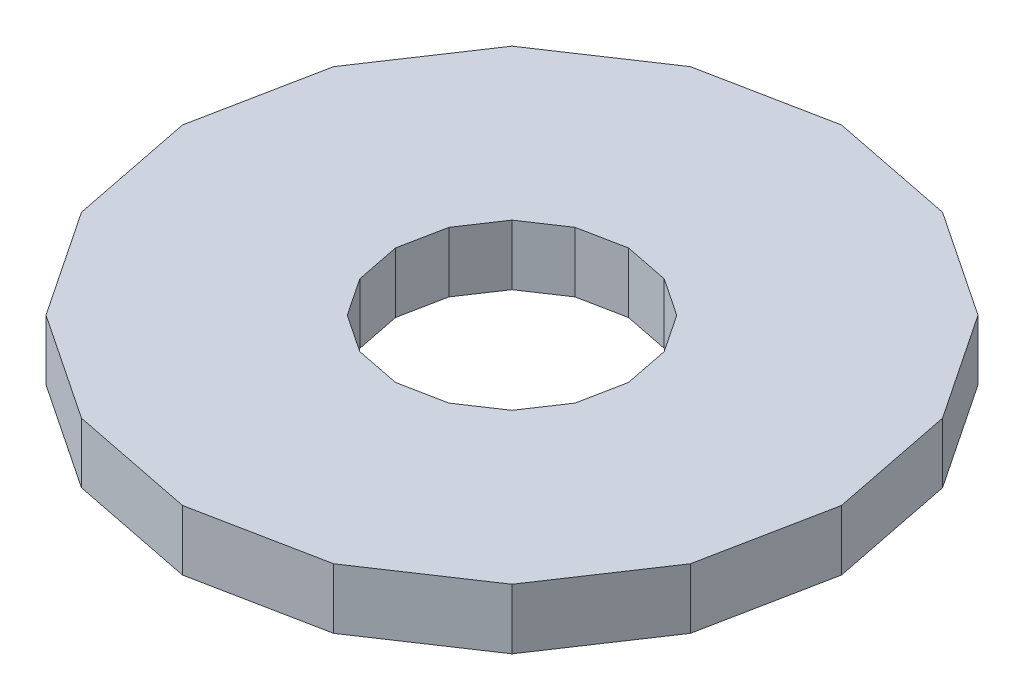
ISO-10303-21;
HEADER;
FILE_DESCRIPTION(('STEP AP214'),'2;1');
FILE_NAME('part.step','',(''),(''),'','','');
FILE_SCHEMA(('AUTOMOTIVE_DESIGN { 1 0 10303 214 1 1 1 1 }'));
ENDSEC;
DATA;
#1=APPLICATION_CONTEXT('core data for automotive mechanical design processes');
#2=APPLICATION_PROTOCOL_DEFINITION('international standard','automotive_design',2000,#1);
#3=PRODUCT_CONTEXT('',#1,'mechanical');
#4=PRODUCT('Part','Part','',(#3));
#5=PRODUCT_RELATED_PRODUCT_CATEGORY('part','',(#4));
#6=PRODUCT_DEFINITION_FORMATION('','',#4);
#7=PRODUCT_DEFINITION_CONTEXT('part definition',#1,'design');
#8=PRODUCT_DEFINITION('design','',#6,#7);
#9=PRODUCT_DEFINITION_SHAPE('','',#8);
#10=(LENGTH_UNIT() NAMED_UNIT(*) SI_UNIT(.MILLI.,.METRE.));
#11=(NAMED_UNIT(*) PLANE_ANGLE_UNIT() SI_UNIT($,.RADIAN.));
#12=(NAMED_UNIT(*) SI_UNIT($,.STERADIAN.) SOLID_ANGLE_UNIT());
#13=UNCERTAINTY_MEASURE_WITH_UNIT(LENGTH_MEASURE(1.E-05),#10,'distance_accuracy_value','');
#14=(GEOMETRIC_REPRESENTATION_CONTEXT(3) GLOBAL_UNCERTAINTY_ASSIGNED_CONTEXT((#13)) GLOBAL_UNIT_ASSIGNED_CONTEXT((#10,
#11,#12)) REPRESENTATION_CONTEXT('',''));
#15=CARTESIAN_POINT('',(0.,0.,0.));
#16=DIRECTION('',(0.,0.,1.));
#17=DIRECTION('',(1.,0.,0.));
#18=AXIS2_PLACEMENT_3D('',#15,#16,#17);
#19=CARTESIAN_POINT('',(0.,19.05,0.));
#20=DIRECTION('',(0.,1.,0.));
#21=DIRECTION('',(0.,0.,1.));
#22=AXIS2_PLACEMENT_3D('',#19,#20,#21);
#23=PLANE('',#22);
#24=DIRECTION('',(0.195090322016117,0.,-0.980785280403233));
#25=VECTOR('',#24,1.);
#26=CARTESIAN_POINT('',(96.2284131094797,19.05,39.8591137955861));
#27=LINE('',#26,#25);
#28=CARTESIAN_POINT('',(96.2284131094797,19.05,39.8591137955861));
#29=VERTEX_POINT('',#28);
#30=CARTESIAN_POINT('',(104.156883796215,19.05,-1.1518686280821E-12));
#31=VERTEX_POINT('',#30);
#32=EDGE_CURVE('E383',#29,#31,#27,.T.);
#33=ORIENTED_EDGE('',*,*,#32,.T.);
#34=DIRECTION('',(-0.19509032201614,0.,-0.980785280403228));
#35=VECTOR('',#34,1.);
#36=CARTESIAN_POINT('',(104.156883796215,19.05,-1.1518686280821E-12));
#37=LINE('',#36,#35);
#38=CARTESIAN_POINT('',(96.2284131094788,19.05,-39.8591137955883));
#39=VERTEX_POINT('',#38);
#40=EDGE_CURVE('E387',#31,#39,#37,.T.);
#41=ORIENTED_EDGE('',*,*,#40,.T.);
#42=DIRECTION('',(-0.555570233019612,0.,-0.831469612302539));
#43=VECTOR('',#42,1.);
#44=CARTESIAN_POINT('',(96.2284131094788,19.05,-39.8591137955883));
#45=LINE('',#44,#43);
#46=CARTESIAN_POINT('',(73.6500388395618,19.05,-73.6500388395635));
#47=VERTEX_POINT('',#46);
#48=EDGE_CURVE('E391',#39,#47,#45,.T.);
#49=ORIENTED_EDGE('',*,*,#48,.T.);
#50=DIRECTION('',(-0.831469612302552,0.,-0.555570233019593));
#51=VECTOR('',#50,1.);
#52=CARTESIAN_POINT('',(73.6500388395618,19.05,-73.6500388395635));
#53=LINE('',#52,#51);
#54=CARTESIAN_POINT('',(39.8591137955863,19.05,-96.2284131094796));
#55=VERTEX_POINT('',#54);
#56=EDGE_CURVE('E393',#47,#55,#53,.T.);
#57=ORIENTED_EDGE('',*,*,#56,.T.);
#58=DIRECTION('',(-0.980785280403233,0.,-0.195090322016117));
#59=VECTOR('',#58,1.);
#60=CARTESIAN_POINT('',(39.8591137955863,19.05,-96.2284131094796));
#61=LINE('',#60,#59);
#62=CARTESIAN_POINT('',(-1.20727870374467E-12,19.05,-104.156883796215));
#63=VERTEX_POINT('',#62);
#64=EDGE_CURVE('E395',#55,#63,#61,.T.);
#65=ORIENTED_EDGE('',*,*,#64,.T.);
#66=DIRECTION('',(-0.980785280403228,0.,0.19509032201614));
#67=VECTOR('',#66,1.);
#68=CARTESIAN_POINT('',(-1.20727870374467E-12,19.05,-104.156883796215));
#69=LINE('',#68,#67);
#70=CARTESIAN_POINT('',(-39.8591137955883,19.05,-96.2284131094787));
#71=VERTEX_POINT('',#70);
#72=EDGE_CURVE('E397',#63,#71,#69,.T.);
#73=ORIENTED_EDGE('',*,*,#72,.T.);
#74=DIRECTION('',(-0.831469612302539,0.,0.555570233019612));
#75=VECTOR('',#74,1.);
#76=CARTESIAN_POINT('',(-39.8591137955883,19.05,-96.2284131094787));
#77=LINE('',#76,#75);
#78=CARTESIAN_POINT('',(-73.6500388395635,19.05,-73.6500388395617));
#79=VERTEX_POINT('',#78);
#80=EDGE_CURVE('E399',#71,#79,#77,.T.);
#81=ORIENTED_EDGE('',*,*,#80,.T.);
#82=DIRECTION('',(-0.555570233019592,0.,0.831469612302552));
#83=VECTOR('',#82,1.);
#84=CARTESIAN_POINT('',(-73.6500388395635,19.05,-73.6500388395617));
#85=LINE('',#84,#83);
#86=CARTESIAN_POINT('',(-96.2284131094796,19.05,-39.8591137955861));
#87=VERTEX_POINT('',#86);
#88=EDGE_CURVE('E401',#79,#87,#85,.T.);
#89=ORIENTED_EDGE('',*,*,#88,.T.);
#90=DIRECTION('',(-0.195090322016117,0.,0.980785280403233));
#91=VECTOR('',#90,1.);
#92=CARTESIAN_POINT('',(-96.2284131094796,19.05,-39.8591137955861));
#93=LINE('',#92,#91);
#94=CARTESIAN_POINT('',(-104.156883796215,19.05,1.24884778880373E-12));
#95=VERTEX_POINT('',#94);
#96=EDGE_CURVE('E403',#87,#95,#93,.T.);
#97=ORIENTED_EDGE('',*,*,#96,.T.);
#98=DIRECTION('',(0.195090322016139,0.,0.980785280403228));
#99=VECTOR('',#98,1.);
#100=CARTESIAN_POINT('',(-104.156883796215,19.05,1.24884778880373E-12));
#101=LINE('',#100,#99);
#102=CARTESIAN_POINT('',(-96.2284131094788,19.05,39.8591137955883));
#103=VERTEX_POINT('',#102);
#104=EDGE_CURVE('E405',#95,#103,#101,.T.);
#105=ORIENTED_EDGE('',*,*,#104,.T.);
#106=DIRECTION('',(0.555570233019612,0.,0.831469612302539));
#107=VECTOR('',#106,1.);
#108=CARTESIAN_POINT('',(-96.2284131094788,19.05,39.8591137955883));
#109=LINE('',#108,#107);
#110=CARTESIAN_POINT('',(-73.6500388395618,19.05,73.6500388395634));
#111=VERTEX_POINT('',#110);
#112=EDGE_CURVE('E407',#103,#111,#109,.T.);
#113=ORIENTED_EDGE('',*,*,#112,.T.);
#114=DIRECTION('',(0.831469612302552,0.,0.555570233019593));
#115=VECTOR('',#114,1.);
#116=CARTESIAN_POINT('',(-73.6500388395618,19.05,73.6500388395634));
#117=LINE('',#116,#115);
#118=CARTESIAN_POINT('',(-39.8591137955861,19.05,96.2284131094797));
#119=VERTEX_POINT('',#118);
#120=EDGE_CURVE('E409',#111,#119,#117,.T.);
#121=ORIENTED_EDGE('',*,*,#120,.T.);
#122=DIRECTION('',(0.980785280403233,0.,0.195090322016117));
#123=VECTOR('',#122,1.);
#124=CARTESIAN_POINT('',(-39.8591137955861,19.05,96.2284131094797));
#125=LINE('',#124,#123);
#126=CARTESIAN_POINT('',(1.17272126011478E-12,19.05,104.156883796215));
#127=VERTEX_POINT('',#126);
#128=EDGE_CURVE('E411',#119,#127,#125,.T.);
#129=ORIENTED_EDGE('',*,*,#128,.T.);
#130=DIRECTION('',(0.980785280403228,0.,-0.195090322016139));
#131=VECTOR('',#130,1.);
#132=CARTESIAN_POINT('',(1.17272126011478E-12,19.05,104.156883796215));
#133=LINE('',#132,#131);
#134=CARTESIAN_POINT('',(39.8591137955883,19.05,96.2284131094788));
#135=VERTEX_POINT('',#134);
#136=EDGE_CURVE('E413',#127,#135,#133,.T.);
#137=ORIENTED_EDGE('',*,*,#136,.T.);
#138=DIRECTION('',(0.831469612302539,0.,-0.555570233019612));
#139=VECTOR('',#138,1.);
#140=CARTESIAN_POINT('',(39.8591137955883,19.05,96.2284131094788));
#141=LINE('',#140,#139);
#142=CARTESIAN_POINT('',(73.6500388395635,19.05,73.6500388395618));
#143=VERTEX_POINT('',#142);
#144=EDGE_CURVE('E416',#135,#143,#141,.T.);
#145=ORIENTED_EDGE('',*,*,#144,.T.);
#146=DIRECTION('',(0.555570233019593,0.,-0.831469612302552));
#147=VECTOR('',#146,1.);
#148=CARTESIAN_POINT('',(73.6500388395635,19.05,73.6500388395618));
#149=LINE('',#148,#147);
#150=EDGE_CURVE('E418',#143,#29,#149,.T.);
#151=ORIENTED_EDGE('',*,*,#150,.T.);
#152=EDGE_LOOP('',(#33,#41,#49,#57,#65,#73,#81,#89,#97,#105,#113,#121,#129,#137,#145,#151));
#153=FACE_BOUND('',#152,.T.);
#154=DIRECTION('',(-0.19509032201614,0.,-0.980785280403228));
#155=VECTOR('',#154,1.);
#156=CARTESIAN_POINT('',(36.8230837081373,19.05,-4.44162525323351E-13));
#157=LINE('',#156,#155);
#158=CARTESIAN_POINT('',(36.8230837081373,19.05,-4.44162525323351E-13));
#159=VERTEX_POINT('',#158);
#160=CARTESIAN_POINT('',(34.0200933618977,19.05,-14.0915840636974));
#161=VERTEX_POINT('',#160);
#162=EDGE_CURVE('E253',#159,#161,#157,.T.);
#163=ORIENTED_EDGE('',*,*,#162,.F.);
#164=DIRECTION('',(0.195090322016117,0.,-0.980785280403233));
#165=VECTOR('',#164,1.);
#166=CARTESIAN_POINT('',(34.020093361898,19.05,14.0915840636966));
#167=LINE('',#166,#165);
#168=CARTESIAN_POINT('',(34.020093361898,19.05,14.0915840636966));
#169=VERTEX_POINT('',#168);
#170=EDGE_CURVE('E244',#169,#159,#167,.T.);
#171=ORIENTED_EDGE('',*,*,#170,.F.);
#172=DIRECTION('',(0.555570233019592,0.,-0.831469612302552));
#173=VECTOR('',#172,1.);
#174=CARTESIAN_POINT('',(26.0378521942241,19.05,26.0378521942235));
#175=LINE('',#174,#173);
#176=CARTESIAN_POINT('',(26.0378521942241,19.05,26.0378521942235));
#177=VERTEX_POINT('',#176);
#178=EDGE_CURVE('E300',#177,#169,#175,.T.);
#179=ORIENTED_EDGE('',*,*,#178,.F.);
#180=DIRECTION('',(0.831469612302539,0.,-0.555570233019612));
#181=VECTOR('',#180,1.);
#182=CARTESIAN_POINT('',(14.0915840636974,19.05,34.0200933618977));
#183=LINE('',#182,#181);
#184=CARTESIAN_POINT('',(14.0915840636974,19.05,34.0200933618977));
#185=VERTEX_POINT('',#184);
#186=EDGE_CURVE('E297',#185,#177,#183,.T.);
#187=ORIENTED_EDGE('',*,*,#186,.F.);
#188=DIRECTION('',(0.980785280403228,0.,-0.19509032201614));
#189=VECTOR('',#188,1.);
#190=CARTESIAN_POINT('',(4.22818382873991E-13,19.05,36.8230837081373));
#191=LINE('',#190,#189);
#192=CARTESIAN_POINT('',(4.22818382873991E-13,19.05,36.8230837081373));
#193=VERTEX_POINT('',#192);
#194=EDGE_CURVE('E294',#193,#185,#191,.T.);
#195=ORIENTED_EDGE('',*,*,#194,.F.);
#196=DIRECTION('',(0.980785280403233,0.,0.195090322016118));
#197=VECTOR('',#196,1.);
#198=CARTESIAN_POINT('',(-14.0915840636966,19.05,34.020093361898));
#199=LINE('',#198,#197);
#200=CARTESIAN_POINT('',(-14.0915840636966,19.05,34.020093361898));
#201=VERTEX_POINT('',#200);
#202=EDGE_CURVE('E292',#201,#193,#199,.T.);
#203=ORIENTED_EDGE('',*,*,#202,.F.);
#204=DIRECTION('',(0.831469612302552,0.,0.555570233019592));
#205=VECTOR('',#204,1.);
#206=CARTESIAN_POINT('',(-26.0378521942235,19.05,26.0378521942241));
#207=LINE('',#206,#205);
#208=CARTESIAN_POINT('',(-26.0378521942235,19.05,26.0378521942241));
#209=VERTEX_POINT('',#208);
#210=EDGE_CURVE('E289',#209,#201,#207,.T.);
#211=ORIENTED_EDGE('',*,*,#210,.F.);
#212=DIRECTION('',(0.555570233019612,0.,0.831469612302539));
#213=VECTOR('',#212,1.);
#214=CARTESIAN_POINT('',(-34.0200933618977,19.05,14.0915840636974));
#215=LINE('',#214,#213);
#216=CARTESIAN_POINT('',(-34.0200933618977,19.05,14.0915840636974));
#217=VERTEX_POINT('',#216);
#218=EDGE_CURVE('E287',#217,#209,#215,.T.);
#219=ORIENTED_EDGE('',*,*,#218,.F.);
#220=DIRECTION('',(0.195090322016139,0.,0.980785280403228));
#221=VECTOR('',#220,1.);
#222=CARTESIAN_POINT('',(-36.8230837081373,19.05,4.47365423314822E-13));
#223=LINE('',#222,#221);
#224=CARTESIAN_POINT('',(-36.8230837081373,19.05,4.47365423314822E-13));
#225=VERTEX_POINT('',#224);
#226=EDGE_CURVE('E284',#225,#217,#223,.T.);
#227=ORIENTED_EDGE('',*,*,#226,.F.);
#228=DIRECTION('',(-0.195090322016117,0.,0.980785280403233));
#229=VECTOR('',#228,1.);
#230=CARTESIAN_POINT('',(-34.020093361898,19.05,-14.0915840636966));
#231=LINE('',#230,#229);
#232=CARTESIAN_POINT('',(-34.020093361898,19.05,-14.0915840636966));
#233=VERTEX_POINT('',#232);
#234=EDGE_CURVE('E281',#233,#225,#231,.T.);
#235=ORIENTED_EDGE('',*,*,#234,.F.);
#236=DIRECTION('',(-0.555570233019593,0.,0.831469612302552));
#237=VECTOR('',#236,1.);
#238=CARTESIAN_POINT('',(-26.0378521942241,19.05,-26.0378521942235));
#239=LINE('',#238,#237);
#240=CARTESIAN_POINT('',(-26.0378521942241,19.05,-26.0378521942235));
#241=VERTEX_POINT('',#240);
#242=EDGE_CURVE('E279',#241,#233,#239,.T.);
#243=ORIENTED_EDGE('',*,*,#242,.F.);
#244=DIRECTION('',(-0.831469612302539,0.,0.555570233019612));
#245=VECTOR('',#244,1.);
#246=CARTESIAN_POINT('',(-14.0915840636974,19.05,-34.0200933618977));
#247=LINE('',#246,#245);
#248=CARTESIAN_POINT('',(-14.0915840636974,19.05,-34.0200933618977));
#249=VERTEX_POINT('',#248);
#250=EDGE_CURVE('E277',#249,#241,#247,.T.);
#251=ORIENTED_EDGE('',*,*,#250,.F.);
#252=DIRECTION('',(-0.980785280403228,0.,0.195090322016139));
#253=VECTOR('',#252,1.);
#254=CARTESIAN_POINT('',(-4.47547971630323E-13,19.05,-36.8230837081373));
#255=LINE('',#254,#253);
#256=CARTESIAN_POINT('',(-4.47547971630323E-13,19.05,-36.8230837081373));
#257=VERTEX_POINT('',#256);
#258=EDGE_CURVE('E275',#257,#249,#255,.T.);
#259=ORIENTED_EDGE('',*,*,#258,.F.);
#260=DIRECTION('',(-0.980785280403233,0.,-0.195090322016117));
#261=VECTOR('',#260,1.);
#262=CARTESIAN_POINT('',(14.0915840636966,19.05,-34.020093361898));
#263=LINE('',#262,#261);
#264=CARTESIAN_POINT('',(14.0915840636966,19.05,-34.020093361898));
#265=VERTEX_POINT('',#264);
#266=EDGE_CURVE('E273',#265,#257,#263,.T.);
#267=ORIENTED_EDGE('',*,*,#266,.F.);
#268=DIRECTION('',(-0.831469612302552,0.,-0.555570233019592));
#269=VECTOR('',#268,1.);
#270=CARTESIAN_POINT('',(26.0378521942235,19.05,-26.0378521942241));
#271=LINE('',#270,#269);
#272=CARTESIAN_POINT('',(26.0378521942235,19.05,-26.0378521942241));
#273=VERTEX_POINT('',#272);
#274=EDGE_CURVE('E269',#273,#265,#271,.T.);
#275=ORIENTED_EDGE('',*,*,#274,.F.);
#276=DIRECTION('',(-0.555570233019612,0.,-0.831469612302539));
#277=VECTOR('',#276,1.);
#278=CARTESIAN_POINT('',(34.0200933618977,19.05,-14.0915840636974));
#279=LINE('',#278,#277);
#280=EDGE_CURVE('E267',#161,#273,#279,.T.);
#281=ORIENTED_EDGE('',*,*,#280,.F.);
#282=EDGE_LOOP('',(#163,#171,#179,#187,#195,#203,#211,#219,#227,#235,#243,#251,#259,#267,#275,#281));
#283=FACE_BOUND('',#282,.T.);
#284=ADVANCED_FACE('F35',(#153,#283),#23,.T.);
#285=CARTESIAN_POINT('',(0.,0.,0.));
#286=DIRECTION('',(0.,1.,0.));
#287=DIRECTION('',(0.,0.,1.));
#288=AXIS2_PLACEMENT_3D('',#285,#286,#287);
#289=PLANE('',#288);
#290=DIRECTION('',(0.195090322016117,0.,-0.980785280403233));
#291=VECTOR('',#290,1.);
#292=CARTESIAN_POINT('',(96.2284131094797,0.,39.8591137955861));
#293=LINE('',#292,#291);
#294=CARTESIAN_POINT('',(96.2284131094797,0.,39.8591137955861));
#295=VERTEX_POINT('',#294);
#296=CARTESIAN_POINT('',(104.156883796215,0.,-1.1518686280821E-12));
#297=VERTEX_POINT('',#296);
#298=EDGE_CURVE('E262',#295,#297,#293,.T.);
#299=ORIENTED_EDGE('',*,*,#298,.F.);
#300=DIRECTION('',(0.555570233019593,0.,-0.831469612302552));
#301=VECTOR('',#300,1.);
#302=CARTESIAN_POINT('',(73.6500388395635,0.,73.6500388395618));
#303=LINE('',#302,#301);
#304=CARTESIAN_POINT('',(73.6500388395635,0.,73.6500388395618));
#305=VERTEX_POINT('',#304);
#306=EDGE_CURVE('E388',#305,#295,#303,.T.);
#307=ORIENTED_EDGE('',*,*,#306,.F.);
#308=DIRECTION('',(0.831469612302539,0.,-0.555570233019612));
#309=VECTOR('',#308,1.);
#310=CARTESIAN_POINT('',(39.8591137955883,0.,96.2284131094788));
#311=LINE('',#310,#309);
#312=CARTESIAN_POINT('',(39.8591137955883,0.,96.2284131094788));
#313=VERTEX_POINT('',#312);
#314=EDGE_CURVE('E451',#313,#305,#311,.T.);
#315=ORIENTED_EDGE('',*,*,#314,.F.);
#316=DIRECTION('',(0.980785280403228,0.,-0.195090322016139));
#317=VECTOR('',#316,1.);
#318=CARTESIAN_POINT('',(1.17272126011478E-12,0.,104.156883796215));
#319=LINE('',#318,#317);
#320=CARTESIAN_POINT('',(1.17272126011478E-12,0.,104.156883796215));
#321=VERTEX_POINT('',#320);
#322=EDGE_CURVE('E449',#321,#313,#319,.T.);
#323=ORIENTED_EDGE('',*,*,#322,.F.);
#324=DIRECTION('',(0.980785280403233,0.,0.195090322016117));
#325=VECTOR('',#324,1.);
#326=CARTESIAN_POINT('',(-39.8591137955861,0.,96.2284131094797));
#327=LINE('',#326,#325);
#328=CARTESIAN_POINT('',(-39.8591137955861,0.,96.2284131094797));
#329=VERTEX_POINT('',#328);
#330=EDGE_CURVE('E447',#329,#321,#327,.T.);
#331=ORIENTED_EDGE('',*,*,#330,.F.);
#332=DIRECTION('',(0.831469612302552,0.,0.555570233019593));
#333=VECTOR('',#332,1.);
#334=CARTESIAN_POINT('',(-73.6500388395618,0.,73.6500388395634));
#335=LINE('',#334,#333);
#336=CARTESIAN_POINT('',(-73.6500388395618,0.,73.6500388395634));
#337=VERTEX_POINT('',#336);
#338=EDGE_CURVE('E445',#337,#329,#335,.T.);
#339=ORIENTED_EDGE('',*,*,#338,.F.);
#340=DIRECTION('',(0.555570233019612,0.,0.831469612302539));
#341=VECTOR('',#340,1.);
#342=CARTESIAN_POINT('',(-96.2284131094788,0.,39.8591137955883));
#343=LINE('',#342,#341);
#344=CARTESIAN_POINT('',(-96.2284131094788,0.,39.8591137955883));
#345=VERTEX_POINT('',#344);
#346=EDGE_CURVE('E443',#345,#337,#343,.T.);
#347=ORIENTED_EDGE('',*,*,#346,.F.);
#348=DIRECTION('',(0.195090322016139,0.,0.980785280403228));
#349=VECTOR('',#348,1.);
#350=CARTESIAN_POINT('',(-104.156883796215,0.,1.24884778880373E-12));
#351=LINE('',#350,#349);
#352=CARTESIAN_POINT('',(-104.156883796215,0.,1.24884778880373E-12));
#353=VERTEX_POINT('',#352);
#354=EDGE_CURVE('E441',#353,#345,#351,.T.);
#355=ORIENTED_EDGE('',*,*,#354,.F.);
#356=DIRECTION('',(-0.195090322016117,0.,0.980785280403233));
#357=VECTOR('',#356,1.);
#358=CARTESIAN_POINT('',(-96.2284131094796,0.,-39.8591137955861));
#359=LINE('',#358,#357);
#360=CARTESIAN_POINT('',(-96.2284131094796,0.,-39.8591137955861));
#361=VERTEX_POINT('',#360);
#362=EDGE_CURVE('E439',#361,#353,#359,.T.);
#363=ORIENTED_EDGE('',*,*,#362,.F.);
#364=DIRECTION('',(-0.555570233019592,0.,0.831469612302552));
#365=VECTOR('',#364,1.);
#366=CARTESIAN_POINT('',(-73.6500388395635,0.,-73.6500388395617));
#367=LINE('',#366,#365);
#368=CARTESIAN_POINT('',(-73.6500388395635,0.,-73.6500388395617));
#369=VERTEX_POINT('',#368);
#370=EDGE_CURVE('E437',#369,#361,#367,.T.);
#371=ORIENTED_EDGE('',*,*,#370,.F.);
#372=DIRECTION('',(-0.831469612302539,0.,0.555570233019612));
#373=VECTOR('',#372,1.);
#374=CARTESIAN_POINT('',(-39.8591137955883,0.,-96.2284131094787));
#375=LINE('',#374,#373);
#376=CARTESIAN_POINT('',(-39.8591137955883,0.,-96.2284131094787));
#377=VERTEX_POINT('',#376);
#378=EDGE_CURVE('E435',#377,#369,#375,.T.);
#379=ORIENTED_EDGE('',*,*,#378,.F.);
#380=DIRECTION('',(-0.980785280403228,0.,0.19509032201614));
#381=VECTOR('',#380,1.);
#382=CARTESIAN_POINT('',(-1.20727870374467E-12,0.,-104.156883796215));
#383=LINE('',#382,#381);
#384=CARTESIAN_POINT('',(-1.20727870374467E-12,0.,-104.156883796215));
#385=VERTEX_POINT('',#384);
#386=EDGE_CURVE('E433',#385,#377,#383,.T.);
#387=ORIENTED_EDGE('',*,*,#386,.F.);
#388=DIRECTION('',(-0.980785280403233,0.,-0.195090322016117));
#389=VECTOR('',#388,1.);
#390=CARTESIAN_POINT('',(39.8591137955863,0.,-96.2284131094796));
#391=LINE('',#390,#389);
#392=CARTESIAN_POINT('',(39.8591137955863,0.,-96.2284131094796));
#393=VERTEX_POINT('',#392);
#394=EDGE_CURVE('E431',#393,#385,#391,.T.);
#395=ORIENTED_EDGE('',*,*,#394,.F.);
#396=DIRECTION('',(-0.831469612302552,0.,-0.555570233019593));
#397=VECTOR('',#396,1.);
#398=CARTESIAN_POINT('',(73.6500388395618,0.,-73.6500388395635));
#399=LINE('',#398,#397);
#400=CARTESIAN_POINT('',(73.6500388395618,0.,-73.6500388395635));
#401=VERTEX_POINT('',#400);
#402=EDGE_CURVE('E428',#401,#393,#399,.T.);
#403=ORIENTED_EDGE('',*,*,#402,.F.);
#404=DIRECTION('',(-0.555570233019612,0.,-0.831469612302539));
#405=VECTOR('',#404,1.);
#406=CARTESIAN_POINT('',(96.2284131094788,0.,-39.8591137955883));
#407=LINE('',#406,#405);
#408=CARTESIAN_POINT('',(96.2284131094788,0.,-39.8591137955883));
#409=VERTEX_POINT('',#408);
#410=EDGE_CURVE('E426',#409,#401,#407,.T.);
#411=ORIENTED_EDGE('',*,*,#410,.F.);
#412=DIRECTION('',(-0.19509032201614,0.,-0.980785280403228));
#413=VECTOR('',#412,1.);
#414=CARTESIAN_POINT('',(104.156883796215,0.,-1.1518686280821E-12));
#415=LINE('',#414,#413);
#416=EDGE_CURVE('E423',#297,#409,#415,.T.);
#417=ORIENTED_EDGE('',*,*,#416,.F.);
#418=EDGE_LOOP('',(#299,#307,#315,#323,#331,#339,#347,#355,#363,#371,#379,#387,#395,#403,#411,#417));
#419=FACE_BOUND('',#418,.T.);
#420=DIRECTION('',(0.195090322016117,0.,-0.980785280403233));
#421=VECTOR('',#420,1.);
#422=CARTESIAN_POINT('',(34.020093361898,0.,14.0915840636966));
#423=LINE('',#422,#421);
#424=CARTESIAN_POINT('',(34.020093361898,0.,14.0915840636966));
#425=VERTEX_POINT('',#424);
#426=CARTESIAN_POINT('',(36.8230837081373,0.,-4.44162525323351E-13));
#427=VERTEX_POINT('',#426);
#428=EDGE_CURVE('E58',#425,#427,#423,.T.);
#429=ORIENTED_EDGE('',*,*,#428,.T.);
#430=DIRECTION('',(-0.19509032201614,0.,-0.980785280403228));
#431=VECTOR('',#430,1.);
#432=CARTESIAN_POINT('',(36.8230837081373,0.,-4.44162525323351E-13));
#433=LINE('',#432,#431);
#434=CARTESIAN_POINT('',(34.0200933618977,0.,-14.0915840636974));
#435=VERTEX_POINT('',#434);
#436=EDGE_CURVE('E260',#427,#435,#433,.T.);
#437=ORIENTED_EDGE('',*,*,#436,.T.);
#438=DIRECTION('',(-0.555570233019612,0.,-0.831469612302539));
#439=VECTOR('',#438,1.);
#440=CARTESIAN_POINT('',(34.0200933618977,0.,-14.0915840636974));
#441=LINE('',#440,#439);
#442=CARTESIAN_POINT('',(26.0378521942235,0.,-26.0378521942241));
#443=VERTEX_POINT('',#442);
#444=EDGE_CURVE('E305',#435,#443,#441,.T.);
#445=ORIENTED_EDGE('',*,*,#444,.T.);
#446=DIRECTION('',(-0.831469612302552,0.,-0.555570233019592));
#447=VECTOR('',#446,1.);
#448=CARTESIAN_POINT('',(26.0378521942235,0.,-26.0378521942241));
#449=LINE('',#448,#447);
#450=CARTESIAN_POINT('',(14.0915840636966,0.,-34.020093361898));
#451=VERTEX_POINT('',#450);
#452=EDGE_CURVE('E309',#443,#451,#449,.T.);
#453=ORIENTED_EDGE('',*,*,#452,.T.);
#454=DIRECTION('',(-0.980785280403233,0.,-0.195090322016117));
#455=VECTOR('',#454,1.);
#456=CARTESIAN_POINT('',(14.0915840636966,0.,-34.020093361898));
#457=LINE('',#456,#455);
#458=CARTESIAN_POINT('',(-4.47547971630323E-13,0.,-36.8230837081373));
#459=VERTEX_POINT('',#458);
#460=EDGE_CURVE('E312',#451,#459,#457,.T.);
#461=ORIENTED_EDGE('',*,*,#460,.T.);
#462=DIRECTION('',(-0.980785280403228,0.,0.195090322016139));
#463=VECTOR('',#462,1.);
#464=CARTESIAN_POINT('',(-4.47547971630323E-13,0.,-36.8230837081373));
#465=LINE('',#464,#463);
#466=CARTESIAN_POINT('',(-14.0915840636974,0.,-34.0200933618977));
#467=VERTEX_POINT('',#466);
#468=EDGE_CURVE('E315',#459,#467,#465,.T.);
#469=ORIENTED_EDGE('',*,*,#468,.T.);
#470=DIRECTION('',(-0.831469612302539,0.,0.555570233019612));
#471=VECTOR('',#470,1.);
#472=CARTESIAN_POINT('',(-14.0915840636974,0.,-34.0200933618977));
#473=LINE('',#472,#471);
#474=CARTESIAN_POINT('',(-26.0378521942241,0.,-26.0378521942235));
#475=VERTEX_POINT('',#474);
#476=EDGE_CURVE('E318',#467,#475,#473,.T.);
#477=ORIENTED_EDGE('',*,*,#476,.T.);
#478=DIRECTION('',(-0.555570233019593,0.,0.831469612302552));
#479=VECTOR('',#478,1.);
#480=CARTESIAN_POINT('',(-26.0378521942241,0.,-26.0378521942235));
#481=LINE('',#480,#479);
#482=CARTESIAN_POINT('',(-34.020093361898,0.,-14.0915840636966));
#483=VERTEX_POINT('',#482);
#484=EDGE_CURVE('E321',#475,#483,#481,.T.);
#485=ORIENTED_EDGE('',*,*,#484,.T.);
#486=DIRECTION('',(-0.195090322016117,0.,0.980785280403233));
#487=VECTOR('',#486,1.);
#488=CARTESIAN_POINT('',(-34.020093361898,0.,-14.0915840636966));
#489=LINE('',#488,#487);
#490=CARTESIAN_POINT('',(-36.8230837081373,0.,4.47365423314822E-13));
#491=VERTEX_POINT('',#490);
#492=EDGE_CURVE('E324',#483,#491,#489,.T.);
#493=ORIENTED_EDGE('',*,*,#492,.T.);
#494=DIRECTION('',(0.195090322016139,0.,0.980785280403228));
#495=VECTOR('',#494,1.);
#496=CARTESIAN_POINT('',(-36.8230837081373,0.,4.47365423314822E-13));
#497=LINE('',#496,#495);
#498=CARTESIAN_POINT('',(-34.0200933618977,0.,14.0915840636974));
#499=VERTEX_POINT('',#498);
#500=EDGE_CURVE('E328',#491,#499,#497,.T.);
#501=ORIENTED_EDGE('',*,*,#500,.T.);
#502=DIRECTION('',(0.555570233019612,0.,0.831469612302539));
#503=VECTOR('',#502,1.);
#504=CARTESIAN_POINT('',(-34.0200933618977,0.,14.0915840636974));
#505=LINE('',#504,#503);
#506=CARTESIAN_POINT('',(-26.0378521942235,0.,26.0378521942241));
#507=VERTEX_POINT('',#506);
#508=EDGE_CURVE('E331',#499,#507,#505,.T.);
#509=ORIENTED_EDGE('',*,*,#508,.T.);
#510=DIRECTION('',(0.831469612302552,0.,0.555570233019592));
#511=VECTOR('',#510,1.);
#512=CARTESIAN_POINT('',(-26.0378521942235,0.,26.0378521942241));
#513=LINE('',#512,#511);
#514=CARTESIAN_POINT('',(-14.0915840636966,0.,34.020093361898));
#515=VERTEX_POINT('',#514);
#516=EDGE_CURVE('E334',#507,#515,#513,.T.);
#517=ORIENTED_EDGE('',*,*,#516,.T.);
#518=DIRECTION('',(0.980785280403233,0.,0.195090322016118));
#519=VECTOR('',#518,1.);
#520=CARTESIAN_POINT('',(-14.0915840636966,0.,34.020093361898));
#521=LINE('',#520,#519);
#522=CARTESIAN_POINT('',(4.22818382873991E-13,0.,36.8230837081373));
#523=VERTEX_POINT('',#522);
#524=EDGE_CURVE('E337',#515,#523,#521,.T.);
#525=ORIENTED_EDGE('',*,*,#524,.T.);
#526=DIRECTION('',(0.980785280403228,0.,-0.19509032201614));
#527=VECTOR('',#526,1.);
#528=CARTESIAN_POINT('',(4.22818382873991E-13,0.,36.8230837081373));
#529=LINE('',#528,#527);
#530=CARTESIAN_POINT('',(14.0915840636974,0.,34.0200933618977));
#531=VERTEX_POINT('',#530);
#532=EDGE_CURVE('E340',#523,#531,#529,.T.);
#533=ORIENTED_EDGE('',*,*,#532,.T.);
#534=DIRECTION('',(0.831469612302539,0.,-0.555570233019612));
#535=VECTOR('',#534,1.);
#536=CARTESIAN_POINT('',(14.0915840636974,0.,34.0200933618977));
#537=LINE('',#536,#535);
#538=CARTESIAN_POINT('',(26.0378521942241,0.,26.0378521942235));
#539=VERTEX_POINT('',#538);
#540=EDGE_CURVE('E343',#531,#539,#537,.T.);
#541=ORIENTED_EDGE('',*,*,#540,.T.);
#542=DIRECTION('',(0.555570233019592,0.,-0.831469612302552));
#543=VECTOR('',#542,1.);
#544=CARTESIAN_POINT('',(26.0378521942241,0.,26.0378521942235));
#545=LINE('',#544,#543);
#546=EDGE_CURVE('E254',#539,#425,#545,.T.);
#547=ORIENTED_EDGE('',*,*,#546,.T.);
#548=EDGE_LOOP('',(#429,#437,#445,#453,#461,#469,#477,#485,#493,#501,#509,#517,#525,#533,#541,#547));
#549=FACE_BOUND('',#548,.T.);
#550=ADVANCED_FACE('F505',(#419,#549),#289,.F.);
#551=CARTESIAN_POINT('',(96.2284131094797,19.05,39.8591137955861));
#552=DIRECTION('',(-0.980785280403233,0.,-0.195090322016117));
#553=DIRECTION('',(-0.195090322016117,0.,0.980785280403233));
#554=AXIS2_PLACEMENT_3D('',#551,#552,#553);
#555=PLANE('',#554);
#556=ORIENTED_EDGE('',*,*,#298,.T.);
#557=DIRECTION('',(0.,-1.,0.));
#558=VECTOR('',#557,1.);
#559=CARTESIAN_POINT('',(104.156883796215,19.05,-1.1518686280821E-12));
#560=LINE('',#559,#558);
#561=EDGE_CURVE('E11',#31,#297,#560,.T.);
#562=ORIENTED_EDGE('',*,*,#561,.F.);
#563=ORIENTED_EDGE('',*,*,#32,.F.);
#564=DIRECTION('',(0.,-1.,0.));
#565=VECTOR('',#564,1.);
#566=CARTESIAN_POINT('',(96.2284131094797,19.05,39.8591137955861));
#567=LINE('',#566,#565);
#568=EDGE_CURVE('E420',#29,#295,#567,.T.);
#569=ORIENTED_EDGE('',*,*,#568,.T.);
#570=EDGE_LOOP('',(#556,#562,#563,#569));
#571=FACE_BOUND('',#570,.T.);
#572=ADVANCED_FACE('F37',(#571),#555,.F.);
#573=CARTESIAN_POINT('',(104.156883796215,19.05,-1.1518686280821E-12));
#574=DIRECTION('',(-0.980785280403228,0.,0.19509032201614));
#575=DIRECTION('',(0.19509032201614,0.,0.980785280403228));
#576=AXIS2_PLACEMENT_3D('',#573,#574,#575);
#577=PLANE('',#576);
#578=ORIENTED_EDGE('',*,*,#416,.T.);
#579=DIRECTION('',(0.,-1.,0.));
#580=VECTOR('',#579,1.);
#581=CARTESIAN_POINT('',(96.2284131094788,19.05,-39.8591137955883));
#582=LINE('',#581,#580);
#583=EDGE_CURVE('E43',#39,#409,#582,.T.);
#584=ORIENTED_EDGE('',*,*,#583,.F.);
#585=ORIENTED_EDGE('',*,*,#40,.F.);
#586=ORIENTED_EDGE('',*,*,#561,.T.);
#587=EDGE_LOOP('',(#578,#584,#585,#586));
#588=FACE_BOUND('',#587,.T.);
#589=ADVANCED_FACE('F522',(#588),#577,.F.);
#590=CARTESIAN_POINT('',(96.2284131094788,19.05,-39.8591137955883));
#591=DIRECTION('',(-0.831469612302539,0.,0.555570233019612));
#592=DIRECTION('',(0.555570233019612,0.,0.831469612302539));
#593=AXIS2_PLACEMENT_3D('',#590,#591,#592);
#594=PLANE('',#593);
#595=ORIENTED_EDGE('',*,*,#410,.T.);
#596=DIRECTION('',(0.,-1.,0.));
#597=VECTOR('',#596,1.);
#598=CARTESIAN_POINT('',(73.6500388395618,19.05,-73.6500388395635));
#599=LINE('',#598,#597);
#600=EDGE_CURVE('E492',#47,#401,#599,.T.);
#601=ORIENTED_EDGE('',*,*,#600,.F.);
#602=ORIENTED_EDGE('',*,*,#48,.F.);
#603=ORIENTED_EDGE('',*,*,#583,.T.);
#604=EDGE_LOOP('',(#595,#601,#602,#603));
#605=FACE_BOUND('',#604,.T.);
#606=ADVANCED_FACE('F499',(#605),#594,.F.);
#607=CARTESIAN_POINT('',(73.6500388395618,19.05,-73.6500388395635));
#608=DIRECTION('',(-0.555570233019593,0.,0.831469612302552));
#609=DIRECTION('',(0.831469612302552,0.,0.555570233019593));
#610=AXIS2_PLACEMENT_3D('',#607,#608,#609);
#611=PLANE('',#610);
#612=ORIENTED_EDGE('',*,*,#402,.T.);
#613=DIRECTION('',(0.,-1.,0.));
#614=VECTOR('',#613,1.);
#615=CARTESIAN_POINT('',(39.8591137955863,19.05,-96.2284131094796));
#616=LINE('',#615,#614);
#617=EDGE_CURVE('E489',#55,#393,#616,.T.);
#618=ORIENTED_EDGE('',*,*,#617,.F.);
#619=ORIENTED_EDGE('',*,*,#56,.F.);
#620=ORIENTED_EDGE('',*,*,#600,.T.);
#621=EDGE_LOOP('',(#612,#618,#619,#620));
#622=FACE_BOUND('',#621,.T.);
#623=ADVANCED_FACE('F511',(#622),#611,.F.);
#624=CARTESIAN_POINT('',(39.8591137955863,19.05,-96.2284131094796));
#625=DIRECTION('',(-0.195090322016117,0.,0.980785280403233));
#626=DIRECTION('',(0.980785280403233,0.,0.195090322016117));
#627=AXIS2_PLACEMENT_3D('',#624,#625,#626);
#628=PLANE('',#627);
#629=ORIENTED_EDGE('',*,*,#394,.T.);
#630=DIRECTION('',(0.,-1.,0.));
#631=VECTOR('',#630,1.);
#632=CARTESIAN_POINT('',(-1.20727870374467E-12,19.05,-104.156883796215));
#633=LINE('',#632,#631);
#634=EDGE_CURVE('E486',#63,#385,#633,.T.);
#635=ORIENTED_EDGE('',*,*,#634,.F.);
#636=ORIENTED_EDGE('',*,*,#64,.F.);
#637=ORIENTED_EDGE('',*,*,#617,.T.);
#638=EDGE_LOOP('',(#629,#635,#636,#637));
#639=FACE_BOUND('',#638,.T.);
#640=ADVANCED_FACE('F515',(#639),#628,.F.);
#641=CARTESIAN_POINT('',(-1.20727870374467E-12,19.05,-104.156883796215));
#642=DIRECTION('',(0.19509032201614,0.,0.980785280403228));
#643=DIRECTION('',(0.980785280403228,0.,-0.19509032201614));
#644=AXIS2_PLACEMENT_3D('',#641,#642,#643);
#645=PLANE('',#644);
#646=ORIENTED_EDGE('',*,*,#386,.T.);
#647=DIRECTION('',(0.,-1.,0.));
#648=VECTOR('',#647,1.);
#649=CARTESIAN_POINT('',(-39.8591137955883,19.05,-96.2284131094787));
#650=LINE('',#649,#648);
#651=EDGE_CURVE('E483',#71,#377,#650,.T.);
#652=ORIENTED_EDGE('',*,*,#651,.F.);
#653=ORIENTED_EDGE('',*,*,#72,.F.);
#654=ORIENTED_EDGE('',*,*,#634,.T.);
#655=EDGE_LOOP('',(#646,#652,#653,#654));
#656=FACE_BOUND('',#655,.T.);
#657=ADVANCED_FACE('F575',(#656),#645,.F.);
#658=CARTESIAN_POINT('',(-39.8591137955883,19.05,-96.2284131094787));
#659=DIRECTION('',(0.555570233019612,0.,0.831469612302539));
#660=DIRECTION('',(0.831469612302539,0.,-0.555570233019612));
#661=AXIS2_PLACEMENT_3D('',#658,#659,#660);
#662=PLANE('',#661);
#663=ORIENTED_EDGE('',*,*,#378,.T.);
#664=DIRECTION('',(0.,-1.,0.));
#665=VECTOR('',#664,1.);
#666=CARTESIAN_POINT('',(-73.6500388395635,19.05,-73.6500388395617));
#667=LINE('',#666,#665);
#668=EDGE_CURVE('E480',#79,#369,#667,.T.);
#669=ORIENTED_EDGE('',*,*,#668,.F.);
#670=ORIENTED_EDGE('',*,*,#80,.F.);
#671=ORIENTED_EDGE('',*,*,#651,.T.);
#672=EDGE_LOOP('',(#663,#669,#670,#671));
#673=FACE_BOUND('',#672,.T.);
#674=ADVANCED_FACE('F572',(#673),#662,.F.);
#675=CARTESIAN_POINT('',(-73.6500388395635,19.05,-73.6500388395617));
#676=DIRECTION('',(0.831469612302552,0.,0.555570233019593));
#677=DIRECTION('',(0.555570233019593,0.,-0.831469612302552));
#678=AXIS2_PLACEMENT_3D('',#675,#676,#677);
#679=PLANE('',#678);
#680=ORIENTED_EDGE('',*,*,#370,.T.);
#681=DIRECTION('',(0.,-1.,0.));
#682=VECTOR('',#681,1.);
#683=CARTESIAN_POINT('',(-96.2284131094796,19.05,-39.8591137955861));
#684=LINE('',#683,#682);
#685=EDGE_CURVE('E477',#87,#361,#684,.T.);
#686=ORIENTED_EDGE('',*,*,#685,.F.);
#687=ORIENTED_EDGE('',*,*,#88,.F.);
#688=ORIENTED_EDGE('',*,*,#668,.T.);
#689=EDGE_LOOP('',(#680,#686,#687,#688));
#690=FACE_BOUND('',#689,.T.);
#691=ADVANCED_FACE('F568',(#690),#679,.F.);
#692=CARTESIAN_POINT('',(-96.2284131094796,19.05,-39.8591137955861));
#693=DIRECTION('',(0.980785280403233,0.,0.195090322016117));
#694=DIRECTION('',(0.195090322016117,0.,-0.980785280403233));
#695=AXIS2_PLACEMENT_3D('',#692,#693,#694);
#696=PLANE('',#695);
#697=ORIENTED_EDGE('',*,*,#362,.T.);
#698=DIRECTION('',(0.,-1.,0.));
#699=VECTOR('',#698,1.);
#700=CARTESIAN_POINT('',(-104.156883796215,19.05,1.24884778880373E-12));
#701=LINE('',#700,#699);
#702=EDGE_CURVE('E474',#95,#353,#701,.T.);
#703=ORIENTED_EDGE('',*,*,#702,.F.);
#704=ORIENTED_EDGE('',*,*,#96,.F.);
#705=ORIENTED_EDGE('',*,*,#685,.T.);
#706=EDGE_LOOP('',(#697,#703,#704,#705));
#707=FACE_BOUND('',#706,.T.);
#708=ADVANCED_FACE('F564',(#707),#696,.F.);
#709=CARTESIAN_POINT('',(-104.156883796215,19.05,1.24884778880373E-12));
#710=DIRECTION('',(0.980785280403228,0.,-0.195090322016139));
#711=DIRECTION('',(-0.195090322016139,0.,-0.980785280403228));
#712=AXIS2_PLACEMENT_3D('',#709,#710,#711);
#713=PLANE('',#712);
#714=ORIENTED_EDGE('',*,*,#354,.T.);
#715=DIRECTION('',(0.,-1.,0.));
#716=VECTOR('',#715,1.);
#717=CARTESIAN_POINT('',(-96.2284131094788,19.05,39.8591137955883));
#718=LINE('',#717,#716);
#719=EDGE_CURVE('E471',#103,#345,#718,.T.);
#720=ORIENTED_EDGE('',*,*,#719,.F.);
#721=ORIENTED_EDGE('',*,*,#104,.F.);
#722=ORIENTED_EDGE('',*,*,#702,.T.);
#723=EDGE_LOOP('',(#714,#720,#721,#722));
#724=FACE_BOUND('',#723,.T.);
#725=ADVANCED_FACE('F559',(#724),#713,.F.);
#726=CARTESIAN_POINT('',(-96.2284131094788,19.05,39.8591137955883));
#727=DIRECTION('',(0.831469612302539,0.,-0.555570233019612));
#728=DIRECTION('',(-0.555570233019612,0.,-0.831469612302539));
#729=AXIS2_PLACEMENT_3D('',#726,#727,#728);
#730=PLANE('',#729);
#731=ORIENTED_EDGE('',*,*,#346,.T.);
#732=DIRECTION('',(0.,-1.,0.));
#733=VECTOR('',#732,1.);
#734=CARTESIAN_POINT('',(-73.6500388395618,19.05,73.6500388395634));
#735=LINE('',#734,#733);
#736=EDGE_CURVE('E468',#111,#337,#735,.T.);
#737=ORIENTED_EDGE('',*,*,#736,.F.);
#738=ORIENTED_EDGE('',*,*,#112,.F.);
#739=ORIENTED_EDGE('',*,*,#719,.T.);
#740=EDGE_LOOP('',(#731,#737,#738,#739));
#741=FACE_BOUND('',#740,.T.);
#742=ADVANCED_FACE('F553',(#741),#730,.F.);
#743=CARTESIAN_POINT('',(-73.6500388395618,19.05,73.6500388395634));
#744=DIRECTION('',(0.555570233019593,0.,-0.831469612302551));
#745=DIRECTION('',(-0.831469612302552,0.,-0.555570233019593));
#746=AXIS2_PLACEMENT_3D('',#743,#744,#745);
#747=PLANE('',#746);
#748=ORIENTED_EDGE('',*,*,#338,.T.);
#749=DIRECTION('',(0.,-1.,0.));
#750=VECTOR('',#749,1.);
#751=CARTESIAN_POINT('',(-39.8591137955861,19.05,96.2284131094797));
#752=LINE('',#751,#750);
#753=EDGE_CURVE('E465',#119,#329,#752,.T.);
#754=ORIENTED_EDGE('',*,*,#753,.F.);
#755=ORIENTED_EDGE('',*,*,#120,.F.);
#756=ORIENTED_EDGE('',*,*,#736,.T.);
#757=EDGE_LOOP('',(#748,#754,#755,#756));
#758=FACE_BOUND('',#757,.T.);
#759=ADVANCED_FACE('F549',(#758),#747,.F.);
#760=CARTESIAN_POINT('',(-39.8591137955861,19.05,96.2284131094797));
#761=DIRECTION('',(0.195090322016117,0.,-0.980785280403233));
#762=DIRECTION('',(-0.980785280403233,0.,-0.195090322016117));
#763=AXIS2_PLACEMENT_3D('',#760,#761,#762);
#764=PLANE('',#763);
#765=ORIENTED_EDGE('',*,*,#330,.T.);
#766=DIRECTION('',(0.,-1.,0.));
#767=VECTOR('',#766,1.);
#768=CARTESIAN_POINT('',(1.17272126011478E-12,19.05,104.156883796215));
#769=LINE('',#768,#767);
#770=EDGE_CURVE('E462',#127,#321,#769,.T.);
#771=ORIENTED_EDGE('',*,*,#770,.F.);
#772=ORIENTED_EDGE('',*,*,#128,.F.);
#773=ORIENTED_EDGE('',*,*,#753,.T.);
#774=EDGE_LOOP('',(#765,#771,#772,#773));
#775=FACE_BOUND('',#774,.T.);
#776=ADVANCED_FACE('F544',(#775),#764,.F.);
#777=CARTESIAN_POINT('',(1.17272126011478E-12,19.05,104.156883796215));
#778=DIRECTION('',(-0.195090322016139,0.,-0.980785280403228));
#779=DIRECTION('',(-0.980785280403228,0.,0.195090322016139));
#780=AXIS2_PLACEMENT_3D('',#777,#778,#779);
#781=PLANE('',#780);
#782=ORIENTED_EDGE('',*,*,#322,.T.);
#783=DIRECTION('',(0.,-1.,0.));
#784=VECTOR('',#783,1.);
#785=CARTESIAN_POINT('',(39.8591137955883,19.05,96.2284131094788));
#786=LINE('',#785,#784);
#787=EDGE_CURVE('E459',#135,#313,#786,.T.);
#788=ORIENTED_EDGE('',*,*,#787,.F.);
#789=ORIENTED_EDGE('',*,*,#136,.F.);
#790=ORIENTED_EDGE('',*,*,#770,.T.);
#791=EDGE_LOOP('',(#782,#788,#789,#790));
#792=FACE_BOUND('',#791,.T.);
#793=ADVANCED_FACE('F538',(#792),#781,.F.);
#794=CARTESIAN_POINT('',(39.8591137955883,19.05,96.2284131094788));
#795=DIRECTION('',(-0.555570233019612,0.,-0.831469612302539));
#796=DIRECTION('',(-0.831469612302539,0.,0.555570233019612));
#797=AXIS2_PLACEMENT_3D('',#794,#795,#796);
#798=PLANE('',#797);
#799=ORIENTED_EDGE('',*,*,#314,.T.);
#800=DIRECTION('',(0.,-1.,0.));
#801=VECTOR('',#800,1.);
#802=CARTESIAN_POINT('',(73.6500388395635,19.05,73.6500388395618));
#803=LINE('',#802,#801);
#804=EDGE_CURVE('E456',#143,#305,#803,.T.);
#805=ORIENTED_EDGE('',*,*,#804,.F.);
#806=ORIENTED_EDGE('',*,*,#144,.F.);
#807=ORIENTED_EDGE('',*,*,#787,.T.);
#808=EDGE_LOOP('',(#799,#805,#806,#807));
#809=FACE_BOUND('',#808,.T.);
#810=ADVANCED_FACE('F534',(#809),#798,.F.);
#811=CARTESIAN_POINT('',(73.6500388395635,19.05,73.6500388395618));
#812=DIRECTION('',(-0.831469612302552,0.,-0.555570233019593));
#813=DIRECTION('',(-0.555570233019593,0.,0.831469612302552));
#814=AXIS2_PLACEMENT_3D('',#811,#812,#813);
#815=PLANE('',#814);
#816=ORIENTED_EDGE('',*,*,#306,.T.);
#817=ORIENTED_EDGE('',*,*,#568,.F.);
#818=ORIENTED_EDGE('',*,*,#150,.F.);
#819=ORIENTED_EDGE('',*,*,#804,.T.);
#820=EDGE_LOOP('',(#816,#817,#818,#819));
#821=FACE_BOUND('',#820,.T.);
#822=ADVANCED_FACE('F529',(#821),#815,.F.);
#823=CARTESIAN_POINT('',(34.020093361898,19.05,14.0915840636966));
#824=DIRECTION('',(-0.980785280403233,0.,-0.195090322016117));
#825=DIRECTION('',(-0.195090322016117,0.,0.980785280403233));
#826=AXIS2_PLACEMENT_3D('',#823,#824,#825);
#827=PLANE('',#826);
#828=ORIENTED_EDGE('',*,*,#428,.F.);
#829=DIRECTION('',(0.,-1.,0.));
#830=VECTOR('',#829,1.);
#831=CARTESIAN_POINT('',(34.020093361898,19.05,14.0915840636966));
#832=LINE('',#831,#830);
#833=EDGE_CURVE('E248',#169,#425,#832,.T.);
#834=ORIENTED_EDGE('',*,*,#833,.F.);
#835=ORIENTED_EDGE('',*,*,#170,.T.);
#836=DIRECTION('',(0.,-1.,0.));
#837=VECTOR('',#836,1.);
#838=CARTESIAN_POINT('',(36.8230837081373,19.05,-4.44162525323351E-13));
#839=LINE('',#838,#837);
#840=EDGE_CURVE('E247',#159,#427,#839,.T.);
#841=ORIENTED_EDGE('',*,*,#840,.T.);
#842=EDGE_LOOP('',(#828,#834,#835,#841));
#843=FACE_BOUND('',#842,.T.);
#844=ADVANCED_FACE('F246',(#843),#827,.T.);
#845=CARTESIAN_POINT('',(36.8230837081373,19.05,-4.44162525323351E-13));
#846=DIRECTION('',(-0.980785280403228,0.,0.19509032201614));
#847=DIRECTION('',(0.19509032201614,0.,0.980785280403228));
#848=AXIS2_PLACEMENT_3D('',#845,#846,#847);
#849=PLANE('',#848);
#850=ORIENTED_EDGE('',*,*,#436,.F.);
#851=ORIENTED_EDGE('',*,*,#840,.F.);
#852=ORIENTED_EDGE('',*,*,#162,.T.);
#853=DIRECTION('',(0.,-1.,0.));
#854=VECTOR('',#853,1.);
#855=CARTESIAN_POINT('',(34.0200933618977,19.05,-14.0915840636974));
#856=LINE('',#855,#854);
#857=EDGE_CURVE('E263',#161,#435,#856,.T.);
#858=ORIENTED_EDGE('',*,*,#857,.T.);
#859=EDGE_LOOP('',(#850,#851,#852,#858));
#860=FACE_BOUND('',#859,.T.);
#861=ADVANCED_FACE('F257',(#860),#849,.T.);
#862=CARTESIAN_POINT('',(34.0200933618977,19.05,-14.0915840636974));
#863=DIRECTION('',(-0.831469612302539,0.,0.555570233019612));
#864=DIRECTION('',(0.555570233019612,0.,0.831469612302539));
#865=AXIS2_PLACEMENT_3D('',#862,#863,#864);
#866=PLANE('',#865);
#867=ORIENTED_EDGE('',*,*,#444,.F.);
#868=ORIENTED_EDGE('',*,*,#857,.F.);
#869=ORIENTED_EDGE('',*,*,#280,.T.);
#870=DIRECTION('',(0.,-1.,0.));
#871=VECTOR('',#870,1.);
#872=CARTESIAN_POINT('',(26.0378521942235,19.05,-26.0378521942241));
#873=LINE('',#872,#871);
#874=EDGE_CURVE('E379',#273,#443,#873,.T.);
#875=ORIENTED_EDGE('',*,*,#874,.T.);
#876=EDGE_LOOP('',(#867,#868,#869,#875));
#877=FACE_BOUND('',#876,.T.);
#878=ADVANCED_FACE('F657',(#877),#866,.T.);
#879=CARTESIAN_POINT('',(26.0378521942235,19.05,-26.0378521942241));
#880=DIRECTION('',(-0.555570233019592,0.,0.831469612302552));
#881=DIRECTION('',(0.831469612302552,0.,0.555570233019592));
#882=AXIS2_PLACEMENT_3D('',#879,#880,#881);
#883=PLANE('',#882);
#884=ORIENTED_EDGE('',*,*,#452,.F.);
#885=ORIENTED_EDGE('',*,*,#874,.F.);
#886=ORIENTED_EDGE('',*,*,#274,.T.);
#887=DIRECTION('',(0.,-1.,0.));
#888=VECTOR('',#887,1.);
#889=CARTESIAN_POINT('',(14.0915840636966,19.05,-34.020093361898));
#890=LINE('',#889,#888);
#891=EDGE_CURVE('E377',#265,#451,#890,.T.);
#892=ORIENTED_EDGE('',*,*,#891,.T.);
#893=EDGE_LOOP('',(#884,#885,#886,#892));
#894=FACE_BOUND('',#893,.T.);
#895=ADVANCED_FACE('F663',(#894),#883,.T.);
#896=CARTESIAN_POINT('',(14.0915840636966,19.05,-34.020093361898));
#897=DIRECTION('',(-0.195090322016117,0.,0.980785280403233));
#898=DIRECTION('',(0.980785280403233,0.,0.195090322016117));
#899=AXIS2_PLACEMENT_3D('',#896,#897,#898);
#900=PLANE('',#899);
#901=ORIENTED_EDGE('',*,*,#460,.F.);
#902=ORIENTED_EDGE('',*,*,#891,.F.);
#903=ORIENTED_EDGE('',*,*,#266,.T.);
#904=DIRECTION('',(0.,-1.,0.));
#905=VECTOR('',#904,1.);
#906=CARTESIAN_POINT('',(-4.47547971630323E-13,19.05,-36.8230837081373));
#907=LINE('',#906,#905);
#908=EDGE_CURVE('E375',#257,#459,#907,.T.);
#909=ORIENTED_EDGE('',*,*,#908,.T.);
#910=EDGE_LOOP('',(#901,#902,#903,#909));
#911=FACE_BOUND('',#910,.T.);
#912=ADVANCED_FACE('F671',(#911),#900,.T.);
#913=CARTESIAN_POINT('',(-4.47547971630323E-13,19.05,-36.8230837081373));
#914=DIRECTION('',(0.195090322016139,0.,0.980785280403228));
#915=DIRECTION('',(0.980785280403228,0.,-0.195090322016139));
#916=AXIS2_PLACEMENT_3D('',#913,#914,#915);
#917=PLANE('',#916);
#918=ORIENTED_EDGE('',*,*,#468,.F.);
#919=ORIENTED_EDGE('',*,*,#908,.F.);
#920=ORIENTED_EDGE('',*,*,#258,.T.);
#921=DIRECTION('',(0.,-1.,0.));
#922=VECTOR('',#921,1.);
#923=CARTESIAN_POINT('',(-14.0915840636974,19.05,-34.0200933618977));
#924=LINE('',#923,#922);
#925=EDGE_CURVE('E372',#249,#467,#924,.T.);
#926=ORIENTED_EDGE('',*,*,#925,.T.);
#927=EDGE_LOOP('',(#918,#919,#920,#926));
#928=FACE_BOUND('',#927,.T.);
#929=ADVANCED_FACE('F679',(#928),#917,.T.);
#930=CARTESIAN_POINT('',(-14.0915840636974,19.05,-34.0200933618977));
#931=DIRECTION('',(0.555570233019612,0.,0.831469612302539));
#932=DIRECTION('',(0.831469612302539,0.,-0.555570233019612));
#933=AXIS2_PLACEMENT_3D('',#930,#931,#932);
#934=PLANE('',#933);
#935=ORIENTED_EDGE('',*,*,#476,.F.);
#936=ORIENTED_EDGE('',*,*,#925,.F.);
#937=ORIENTED_EDGE('',*,*,#250,.T.);
#938=DIRECTION('',(0.,-1.,0.));
#939=VECTOR('',#938,1.);
#940=CARTESIAN_POINT('',(-26.0378521942241,19.05,-26.0378521942235));
#941=LINE('',#940,#939);
#942=EDGE_CURVE('E369',#241,#475,#941,.T.);
#943=ORIENTED_EDGE('',*,*,#942,.T.);
#944=EDGE_LOOP('',(#935,#936,#937,#943));
#945=FACE_BOUND('',#944,.T.);
#946=ADVANCED_FACE('F687',(#945),#934,.T.);
#947=CARTESIAN_POINT('',(-26.0378521942241,19.05,-26.0378521942235));
#948=DIRECTION('',(0.831469612302552,0.,0.555570233019593));
#949=DIRECTION('',(0.555570233019593,0.,-0.831469612302552));
#950=AXIS2_PLACEMENT_3D('',#947,#948,#949);
#951=PLANE('',#950);
#952=ORIENTED_EDGE('',*,*,#484,.F.);
#953=ORIENTED_EDGE('',*,*,#942,.F.);
#954=ORIENTED_EDGE('',*,*,#242,.T.);
#955=DIRECTION('',(0.,-1.,0.));
#956=VECTOR('',#955,1.);
#957=CARTESIAN_POINT('',(-34.020093361898,19.05,-14.0915840636966));
#958=LINE('',#957,#956);
#959=EDGE_CURVE('E366',#233,#483,#958,.T.);
#960=ORIENTED_EDGE('',*,*,#959,.T.);
#961=EDGE_LOOP('',(#952,#953,#954,#960));
#962=FACE_BOUND('',#961,.T.);
#963=ADVANCED_FACE('F695',(#962),#951,.T.);
#964=CARTESIAN_POINT('',(-34.020093361898,19.05,-14.0915840636966));
#965=DIRECTION('',(0.980785280403233,0.,0.195090322016117));
#966=DIRECTION('',(0.195090322016117,0.,-0.980785280403233));
#967=AXIS2_PLACEMENT_3D('',#964,#965,#966);
#968=PLANE('',#967);
#969=ORIENTED_EDGE('',*,*,#492,.F.);
#970=ORIENTED_EDGE('',*,*,#959,.F.);
#971=ORIENTED_EDGE('',*,*,#234,.T.);
#972=DIRECTION('',(0.,-1.,0.));
#973=VECTOR('',#972,1.);
#974=CARTESIAN_POINT('',(-36.8230837081373,19.05,4.47365423314822E-13));
#975=LINE('',#974,#973);
#976=EDGE_CURVE('E363',#225,#491,#975,.T.);
#977=ORIENTED_EDGE('',*,*,#976,.T.);
#978=EDGE_LOOP('',(#969,#970,#971,#977));
#979=FACE_BOUND('',#978,.T.);
#980=ADVANCED_FACE('F703',(#979),#968,.T.);
#981=CARTESIAN_POINT('',(-36.8230837081373,19.05,4.47365423314822E-13));
#982=DIRECTION('',(0.980785280403228,0.,-0.195090322016139));
#983=DIRECTION('',(-0.195090322016139,0.,-0.980785280403228));
#984=AXIS2_PLACEMENT_3D('',#981,#982,#983);
#985=PLANE('',#984);
#986=ORIENTED_EDGE('',*,*,#500,.F.);
#987=ORIENTED_EDGE('',*,*,#976,.F.);
#988=ORIENTED_EDGE('',*,*,#226,.T.);
#989=DIRECTION('',(0.,-1.,0.));
#990=VECTOR('',#989,1.);
#991=CARTESIAN_POINT('',(-34.0200933618977,19.05,14.0915840636974));
#992=LINE('',#991,#990);
#993=EDGE_CURVE('E361',#217,#499,#992,.T.);
#994=ORIENTED_EDGE('',*,*,#993,.T.);
#995=EDGE_LOOP('',(#986,#987,#988,#994));
#996=FACE_BOUND('',#995,.T.);
#997=ADVANCED_FACE('F711',(#996),#985,.T.);
#998=CARTESIAN_POINT('',(-34.0200933618977,19.05,14.0915840636974));
#999=DIRECTION('',(0.831469612302539,0.,-0.555570233019612));
#1000=DIRECTION('',(-0.555570233019612,0.,-0.831469612302539));
#1001=AXIS2_PLACEMENT_3D('',#998,#999,#1000);
#1002=PLANE('',#1001);
#1003=ORIENTED_EDGE('',*,*,#508,.F.);
#1004=ORIENTED_EDGE('',*,*,#993,.F.);
#1005=ORIENTED_EDGE('',*,*,#218,.T.);
#1006=DIRECTION('',(0.,-1.,0.));
#1007=VECTOR('',#1006,1.);
#1008=CARTESIAN_POINT('',(-26.0378521942235,19.05,26.0378521942241));
#1009=LINE('',#1008,#1007);
#1010=EDGE_CURVE('E358',#209,#507,#1009,.T.);
#1011=ORIENTED_EDGE('',*,*,#1010,.T.);
#1012=EDGE_LOOP('',(#1003,#1004,#1005,#1011));
#1013=FACE_BOUND('',#1012,.T.);
#1014=ADVANCED_FACE('F719',(#1013),#1002,.T.);
#1015=CARTESIAN_POINT('',(-26.0378521942235,19.05,26.0378521942241));
#1016=DIRECTION('',(0.555570233019592,0.,-0.831469612302552));
#1017=DIRECTION('',(-0.831469612302552,0.,-0.555570233019592));
#1018=AXIS2_PLACEMENT_3D('',#1015,#1016,#1017);
#1019=PLANE('',#1018);
#1020=ORIENTED_EDGE('',*,*,#516,.F.);
#1021=ORIENTED_EDGE('',*,*,#1010,.F.);
#1022=ORIENTED_EDGE('',*,*,#210,.T.);
#1023=DIRECTION('',(0.,-1.,0.));
#1024=VECTOR('',#1023,1.);
#1025=CARTESIAN_POINT('',(-14.0915840636966,19.05,34.020093361898));
#1026=LINE('',#1025,#1024);
#1027=EDGE_CURVE('E356',#201,#515,#1026,.T.);
#1028=ORIENTED_EDGE('',*,*,#1027,.T.);
#1029=EDGE_LOOP('',(#1020,#1021,#1022,#1028));
#1030=FACE_BOUND('',#1029,.T.);
#1031=ADVANCED_FACE('F727',(#1030),#1019,.T.);
#1032=CARTESIAN_POINT('',(-14.0915840636966,19.05,34.020093361898));
#1033=DIRECTION('',(0.195090322016118,0.,-0.980785280403233));
#1034=DIRECTION('',(-0.980785280403233,0.,-0.195090322016118));
#1035=AXIS2_PLACEMENT_3D('',#1032,#1033,#1034);
#1036=PLANE('',#1035);
#1037=ORIENTED_EDGE('',*,*,#524,.F.);
#1038=ORIENTED_EDGE('',*,*,#1027,.F.);
#1039=ORIENTED_EDGE('',*,*,#202,.T.);
#1040=DIRECTION('',(0.,-1.,0.));
#1041=VECTOR('',#1040,1.);
#1042=CARTESIAN_POINT('',(4.22818382873991E-13,19.05,36.8230837081373));
#1043=LINE('',#1042,#1041);
#1044=EDGE_CURVE('E354',#193,#523,#1043,.T.);
#1045=ORIENTED_EDGE('',*,*,#1044,.T.);
#1046=EDGE_LOOP('',(#1037,#1038,#1039,#1045));
#1047=FACE_BOUND('',#1046,.T.);
#1048=ADVANCED_FACE('F735',(#1047),#1036,.T.);
#1049=CARTESIAN_POINT('',(4.22818382873991E-13,19.05,36.8230837081373));
#1050=DIRECTION('',(-0.19509032201614,0.,-0.980785280403228));
#1051=DIRECTION('',(-0.980785280403228,0.,0.19509032201614));
#1052=AXIS2_PLACEMENT_3D('',#1049,#1050,#1051);
#1053=PLANE('',#1052);
#1054=ORIENTED_EDGE('',*,*,#532,.F.);
#1055=ORIENTED_EDGE('',*,*,#1044,.F.);
#1056=ORIENTED_EDGE('',*,*,#194,.T.);
#1057=DIRECTION('',(0.,-1.,0.));
#1058=VECTOR('',#1057,1.);
#1059=CARTESIAN_POINT('',(14.0915840636974,19.05,34.0200933618977));
#1060=LINE('',#1059,#1058);
#1061=EDGE_CURVE('E352',#185,#531,#1060,.T.);
#1062=ORIENTED_EDGE('',*,*,#1061,.T.);
#1063=EDGE_LOOP('',(#1054,#1055,#1056,#1062));
#1064=FACE_BOUND('',#1063,.T.);
#1065=ADVANCED_FACE('F743',(#1064),#1053,.T.);
#1066=CARTESIAN_POINT('',(14.0915840636974,19.05,34.0200933618977));
#1067=DIRECTION('',(-0.555570233019612,0.,-0.831469612302539));
#1068=DIRECTION('',(-0.831469612302539,0.,0.555570233019612));
#1069=AXIS2_PLACEMENT_3D('',#1066,#1067,#1068);
#1070=PLANE('',#1069);
#1071=ORIENTED_EDGE('',*,*,#540,.F.);
#1072=ORIENTED_EDGE('',*,*,#1061,.F.);
#1073=ORIENTED_EDGE('',*,*,#186,.T.);
#1074=DIRECTION('',(0.,-1.,0.));
#1075=VECTOR('',#1074,1.);
#1076=CARTESIAN_POINT('',(26.0378521942241,19.05,26.0378521942235));
#1077=LINE('',#1076,#1075);
#1078=EDGE_CURVE('E50',#177,#539,#1077,.T.);
#1079=ORIENTED_EDGE('',*,*,#1078,.T.);
#1080=EDGE_LOOP('',(#1071,#1072,#1073,#1079));
#1081=FACE_BOUND('',#1080,.T.);
#1082=ADVANCED_FACE('F751',(#1081),#1070,.T.);
#1083=CARTESIAN_POINT('',(26.0378521942241,19.05,26.0378521942235));
#1084=DIRECTION('',(-0.831469612302552,0.,-0.555570233019592));
#1085=DIRECTION('',(-0.555570233019592,0.,0.831469612302552));
#1086=AXIS2_PLACEMENT_3D('',#1083,#1084,#1085);
#1087=PLANE('',#1086);
#1088=ORIENTED_EDGE('',*,*,#546,.F.);
#1089=ORIENTED_EDGE('',*,*,#1078,.F.);
#1090=ORIENTED_EDGE('',*,*,#178,.T.);
#1091=ORIENTED_EDGE('',*,*,#833,.T.);
#1092=EDGE_LOOP('',(#1088,#1089,#1090,#1091));
#1093=FACE_BOUND('',#1092,.T.);
#1094=ADVANCED_FACE('F759',(#1093),#1087,.T.);
#1095=CLOSED_SHELL('',(#284,#550,#572,#589,#606,#623,#640,#657,#674,#691,#708,#725,#742,#759,
#776,#793,#810,#822,#844,#861,#878,#895,#912,#929,#946,#963,#980,#997,#1014,#1031,#1048,#1065,
#1082,#1094));
#1096=MANIFOLD_SOLID_BREP('B2',#1095);
#1097=ADVANCED_BREP_SHAPE_REPRESENTATION('',(#18,#1096),#14);
#1098=SHAPE_DEFINITION_REPRESENTATION(#9,#1097);
ENDSEC;
END-ISO-10303-21;
